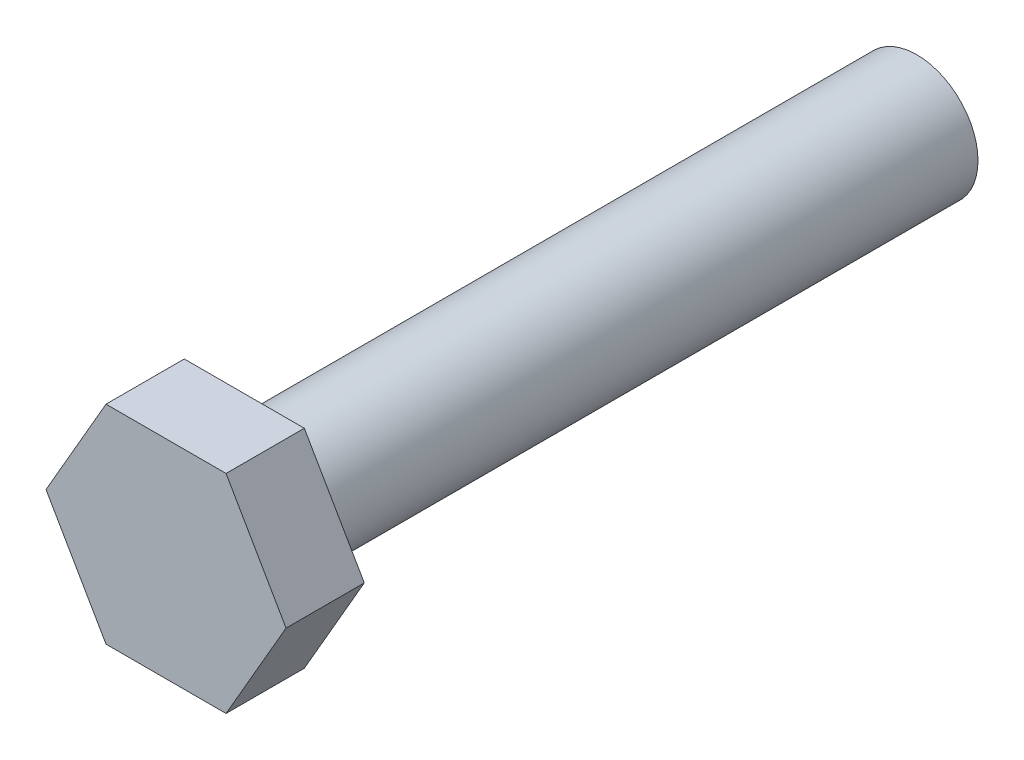
ISO-10303-21;
HEADER;
FILE_DESCRIPTION(('STEP AP214'),'2;1');
FILE_NAME('part.step','',(''),(''),'','','');
FILE_SCHEMA(('AUTOMOTIVE_DESIGN { 1 0 10303 214 1 1 1 1 }'));
ENDSEC;
DATA;
#1=APPLICATION_CONTEXT('core data for automotive mechanical design processes');
#2=APPLICATION_PROTOCOL_DEFINITION('international standard','automotive_design',2000,#1);
#3=PRODUCT_CONTEXT('',#1,'mechanical');
#4=PRODUCT('Part','Part','',(#3));
#5=PRODUCT_RELATED_PRODUCT_CATEGORY('part','',(#4));
#6=PRODUCT_DEFINITION_FORMATION('','',#4);
#7=PRODUCT_DEFINITION_CONTEXT('part definition',#1,'design');
#8=PRODUCT_DEFINITION('design','',#6,#7);
#9=PRODUCT_DEFINITION_SHAPE('','',#8);
#10=(LENGTH_UNIT() NAMED_UNIT(*) SI_UNIT(.MILLI.,.METRE.));
#11=(NAMED_UNIT(*) PLANE_ANGLE_UNIT() SI_UNIT($,.RADIAN.));
#12=(NAMED_UNIT(*) SI_UNIT($,.STERADIAN.) SOLID_ANGLE_UNIT());
#13=UNCERTAINTY_MEASURE_WITH_UNIT(LENGTH_MEASURE(1.E-05),#10,'distance_accuracy_value','');
#14=(GEOMETRIC_REPRESENTATION_CONTEXT(3) GLOBAL_UNCERTAINTY_ASSIGNED_CONTEXT((#13)) GLOBAL_UNIT_ASSIGNED_CONTEXT((#10,
#11,#12)) REPRESENTATION_CONTEXT('',''));
#15=CARTESIAN_POINT('',(0.,0.,0.));
#16=DIRECTION('',(0.,0.,1.));
#17=DIRECTION('',(1.,0.,0.));
#18=AXIS2_PLACEMENT_3D('',#15,#16,#17);
#19=CARTESIAN_POINT('',(0.,0.,-55.));
#20=DIRECTION('',(0.,0.,1.));
#21=DIRECTION('',(1.,0.,0.));
#22=AXIS2_PLACEMENT_3D('',#19,#20,#21);
#23=CYLINDRICAL_SURFACE('',#22,5.);
#24=CARTESIAN_POINT('',(0.,0.,-55.));
#25=DIRECTION('',(0.,0.,1.));
#26=DIRECTION('',(1.,0.,0.));
#27=AXIS2_PLACEMENT_3D('',#24,#25,#26);
#28=CIRCLE('',#27,5.);
#29=CARTESIAN_POINT('',(5.,0.,-55.));
#30=VERTEX_POINT('',#29);
#31=EDGE_CURVE('E11',#30,#30,#28,.T.);
#32=ORIENTED_EDGE('',*,*,#31,.T.);
#33=EDGE_LOOP('',(#32));
#34=FACE_BOUND('',#33,.T.);
#35=CARTESIAN_POINT('',(0.,0.,0.));
#36=DIRECTION('',(0.,0.,1.));
#37=DIRECTION('',(1.,0.,0.));
#38=AXIS2_PLACEMENT_3D('',#35,#36,#37);
#39=CIRCLE('',#38,5.);
#40=CARTESIAN_POINT('',(5.,0.,0.));
#41=VERTEX_POINT('',#40);
#42=EDGE_CURVE('E38',#41,#41,#39,.T.);
#43=ORIENTED_EDGE('',*,*,#42,.F.);
#44=EDGE_LOOP('',(#43));
#45=FACE_BOUND('',#44,.T.);
#46=ADVANCED_FACE('F35',(#34,#45),#23,.T.);
#47=CARTESIAN_POINT('',(0.,0.,-55.));
#48=DIRECTION('',(0.,0.,1.));
#49=DIRECTION('',(1.,0.,0.));
#50=AXIS2_PLACEMENT_3D('',#47,#48,#49);
#51=PLANE('',#50);
#52=ORIENTED_EDGE('',*,*,#31,.F.);
#53=EDGE_LOOP('',(#52));
#54=FACE_BOUND('',#53,.T.);
#55=ADVANCED_FACE('F146',(#54),#51,.F.);
#56=CARTESIAN_POINT('',(4.90747728811182,8.5,6.4));
#57=DIRECTION('',(0.,-1.,0.));
#58=DIRECTION('',(0.,0.,-1.));
#59=AXIS2_PLACEMENT_3D('',#56,#57,#58);
#60=PLANE('',#59);
#61=DIRECTION('',(-1.,0.,0.));
#62=VECTOR('',#61,1.);
#63=CARTESIAN_POINT('',(4.90747728811182,8.5,0.));
#64=LINE('',#63,#62);
#65=CARTESIAN_POINT('',(4.90747728811182,8.5,0.));
#66=VERTEX_POINT('',#65);
#67=CARTESIAN_POINT('',(-4.90747728811182,8.5,0.));
#68=VERTEX_POINT('',#67);
#69=EDGE_CURVE('E120',#66,#68,#64,.T.);
#70=ORIENTED_EDGE('',*,*,#69,.T.);
#71=DIRECTION('',(0.,0.,-1.));
#72=VECTOR('',#71,1.);
#73=CARTESIAN_POINT('',(-4.90747728811182,8.5,6.4));
#74=LINE('',#73,#72);
#75=CARTESIAN_POINT('',(-4.90747728811182,8.5,6.4));
#76=VERTEX_POINT('',#75);
#77=EDGE_CURVE('E137',#76,#68,#74,.T.);
#78=ORIENTED_EDGE('',*,*,#77,.F.);
#79=DIRECTION('',(-1.,0.,0.));
#80=VECTOR('',#79,1.);
#81=CARTESIAN_POINT('',(4.90747728811182,8.5,6.4));
#82=LINE('',#81,#80);
#83=CARTESIAN_POINT('',(4.90747728811182,8.5,6.4));
#84=VERTEX_POINT('',#83);
#85=EDGE_CURVE('E130',#84,#76,#82,.T.);
#86=ORIENTED_EDGE('',*,*,#85,.F.);
#87=DIRECTION('',(0.,0.,-1.));
#88=VECTOR('',#87,1.);
#89=CARTESIAN_POINT('',(4.90747728811182,8.5,6.4));
#90=LINE('',#89,#88);
#91=EDGE_CURVE('E116',#84,#66,#90,.T.);
#92=ORIENTED_EDGE('',*,*,#91,.T.);
#93=EDGE_LOOP('',(#70,#78,#86,#92));
#94=FACE_BOUND('',#93,.T.);
#95=ADVANCED_FACE('F151',(#94),#60,.F.);
#96=CARTESIAN_POINT('',(-4.90747728811182,8.5,6.4));
#97=DIRECTION('',(0.866025403784439,-0.5,0.));
#98=DIRECTION('',(0.5,0.866025403784439,0.));
#99=AXIS2_PLACEMENT_3D('',#96,#97,#98);
#100=PLANE('',#99);
#101=DIRECTION('',(-0.5,-0.866025403784439,0.));
#102=VECTOR('',#101,1.);
#103=CARTESIAN_POINT('',(-4.90747728811182,8.5,0.));
#104=LINE('',#103,#102);
#105=CARTESIAN_POINT('',(-9.81495457622364,0.,0.));
#106=VERTEX_POINT('',#105);
#107=EDGE_CURVE('E123',#68,#106,#104,.T.);
#108=ORIENTED_EDGE('',*,*,#107,.T.);
#109=DIRECTION('',(0.,0.,-1.));
#110=VECTOR('',#109,1.);
#111=CARTESIAN_POINT('',(-9.81495457622364,0.,6.4));
#112=LINE('',#111,#110);
#113=CARTESIAN_POINT('',(-9.81495457622364,0.,6.4));
#114=VERTEX_POINT('',#113);
#115=EDGE_CURVE('E134',#114,#106,#112,.T.);
#116=ORIENTED_EDGE('',*,*,#115,.F.);
#117=DIRECTION('',(-0.5,-0.866025403784439,0.));
#118=VECTOR('',#117,1.);
#119=CARTESIAN_POINT('',(-4.90747728811182,8.5,6.4));
#120=LINE('',#119,#118);
#121=EDGE_CURVE('E89',#76,#114,#120,.T.);
#122=ORIENTED_EDGE('',*,*,#121,.F.);
#123=ORIENTED_EDGE('',*,*,#77,.T.);
#124=EDGE_LOOP('',(#108,#116,#122,#123));
#125=FACE_BOUND('',#124,.T.);
#126=ADVANCED_FACE('F157',(#125),#100,.F.);
#127=CARTESIAN_POINT('',(-9.81495457622364,0.,6.4));
#128=DIRECTION('',(0.866025403784439,0.5,0.));
#129=DIRECTION('',(-0.5,0.866025403784439,0.));
#130=AXIS2_PLACEMENT_3D('',#127,#128,#129);
#131=PLANE('',#130);
#132=DIRECTION('',(0.5,-0.866025403784439,0.));
#133=VECTOR('',#132,1.);
#134=CARTESIAN_POINT('',(-9.81495457622364,0.,0.));
#135=LINE('',#134,#133);
#136=CARTESIAN_POINT('',(-4.90747728811182,-8.5,0.));
#137=VERTEX_POINT('',#136);
#138=EDGE_CURVE('E125',#106,#137,#135,.T.);
#139=ORIENTED_EDGE('',*,*,#138,.T.);
#140=DIRECTION('',(0.,0.,-1.));
#141=VECTOR('',#140,1.);
#142=CARTESIAN_POINT('',(-4.90747728811182,-8.5,6.4));
#143=LINE('',#142,#141);
#144=CARTESIAN_POINT('',(-4.90747728811182,-8.5,6.4));
#145=VERTEX_POINT('',#144);
#146=EDGE_CURVE('E111',#145,#137,#143,.T.);
#147=ORIENTED_EDGE('',*,*,#146,.F.);
#148=DIRECTION('',(0.5,-0.866025403784439,0.));
#149=VECTOR('',#148,1.);
#150=CARTESIAN_POINT('',(-9.81495457622364,0.,6.4));
#151=LINE('',#150,#149);
#152=EDGE_CURVE('E102',#114,#145,#151,.T.);
#153=ORIENTED_EDGE('',*,*,#152,.F.);
#154=ORIENTED_EDGE('',*,*,#115,.T.);
#155=EDGE_LOOP('',(#139,#147,#153,#154));
#156=FACE_BOUND('',#155,.T.);
#157=ADVANCED_FACE('F163',(#156),#131,.F.);
#158=CARTESIAN_POINT('',(-4.90747728811182,-8.5,6.4));
#159=DIRECTION('',(0.,1.,0.));
#160=DIRECTION('',(-1.,0.,0.));
#161=AXIS2_PLACEMENT_3D('',#158,#159,#160);
#162=PLANE('',#161);
#163=DIRECTION('',(1.,0.,0.));
#164=VECTOR('',#163,1.);
#165=CARTESIAN_POINT('',(-4.90747728811182,-8.5,0.));
#166=LINE('',#165,#164);
#167=CARTESIAN_POINT('',(4.90747728811182,-8.5,0.));
#168=VERTEX_POINT('',#167);
#169=EDGE_CURVE('E110',#137,#168,#166,.T.);
#170=ORIENTED_EDGE('',*,*,#169,.T.);
#171=DIRECTION('',(0.,0.,-1.));
#172=VECTOR('',#171,1.);
#173=CARTESIAN_POINT('',(4.90747728811182,-8.5,6.4));
#174=LINE('',#173,#172);
#175=CARTESIAN_POINT('',(4.90747728811182,-8.5,6.4));
#176=VERTEX_POINT('',#175);
#177=EDGE_CURVE('E107',#176,#168,#174,.T.);
#178=ORIENTED_EDGE('',*,*,#177,.F.);
#179=DIRECTION('',(1.,0.,0.));
#180=VECTOR('',#179,1.);
#181=CARTESIAN_POINT('',(-4.90747728811182,-8.5,6.4));
#182=LINE('',#181,#180);
#183=EDGE_CURVE('E96',#145,#176,#182,.T.);
#184=ORIENTED_EDGE('',*,*,#183,.F.);
#185=ORIENTED_EDGE('',*,*,#146,.T.);
#186=EDGE_LOOP('',(#170,#178,#184,#185));
#187=FACE_BOUND('',#186,.T.);
#188=ADVANCED_FACE('F108',(#187),#162,.F.);
#189=CARTESIAN_POINT('',(4.90747728811182,-8.5,6.4));
#190=DIRECTION('',(-0.866025403784439,0.5,0.));
#191=DIRECTION('',(-0.5,-0.866025403784439,0.));
#192=AXIS2_PLACEMENT_3D('',#189,#190,#191);
#193=PLANE('',#192);
#194=DIRECTION('',(0.5,0.866025403784439,0.));
#195=VECTOR('',#194,1.);
#196=CARTESIAN_POINT('',(4.90747728811182,-8.5,0.));
#197=LINE('',#196,#195);
#198=CARTESIAN_POINT('',(9.81495457622364,0.,0.));
#199=VERTEX_POINT('',#198);
#200=EDGE_CURVE('E74',#168,#199,#197,.T.);
#201=ORIENTED_EDGE('',*,*,#200,.T.);
#202=DIRECTION('',(0.,0.,-1.));
#203=VECTOR('',#202,1.);
#204=CARTESIAN_POINT('',(9.81495457622364,0.,6.4));
#205=LINE('',#204,#203);
#206=CARTESIAN_POINT('',(9.81495457622364,0.,6.4));
#207=VERTEX_POINT('',#206);
#208=EDGE_CURVE('E112',#207,#199,#205,.T.);
#209=ORIENTED_EDGE('',*,*,#208,.F.);
#210=DIRECTION('',(0.5,0.866025403784439,0.));
#211=VECTOR('',#210,1.);
#212=CARTESIAN_POINT('',(4.90747728811182,-8.5,6.4));
#213=LINE('',#212,#211);
#214=EDGE_CURVE('E100',#176,#207,#213,.T.);
#215=ORIENTED_EDGE('',*,*,#214,.F.);
#216=ORIENTED_EDGE('',*,*,#177,.T.);
#217=EDGE_LOOP('',(#201,#209,#215,#216));
#218=FACE_BOUND('',#217,.T.);
#219=ADVANCED_FACE('F114',(#218),#193,.F.);
#220=CARTESIAN_POINT('',(9.81495457622364,0.,6.4));
#221=DIRECTION('',(-0.866025403784439,-0.5,0.));
#222=DIRECTION('',(0.5,-0.866025403784439,0.));
#223=AXIS2_PLACEMENT_3D('',#220,#221,#222);
#224=PLANE('',#223);
#225=DIRECTION('',(-0.5,0.866025403784439,0.));
#226=VECTOR('',#225,1.);
#227=CARTESIAN_POINT('',(9.81495457622364,0.,0.));
#228=LINE('',#227,#226);
#229=EDGE_CURVE('E80',#199,#66,#228,.T.);
#230=ORIENTED_EDGE('',*,*,#229,.T.);
#231=ORIENTED_EDGE('',*,*,#91,.F.);
#232=DIRECTION('',(-0.5,0.866025403784439,0.));
#233=VECTOR('',#232,1.);
#234=CARTESIAN_POINT('',(9.81495457622364,0.,6.4));
#235=LINE('',#234,#233);
#236=EDGE_CURVE('E51',#207,#84,#235,.T.);
#237=ORIENTED_EDGE('',*,*,#236,.F.);
#238=ORIENTED_EDGE('',*,*,#208,.T.);
#239=EDGE_LOOP('',(#230,#231,#237,#238));
#240=FACE_BOUND('',#239,.T.);
#241=ADVANCED_FACE('F171',(#240),#224,.F.);
#242=CARTESIAN_POINT('',(-14.7224318643355,8.5,6.4));
#243=DIRECTION('',(0.,0.,1.));
#244=DIRECTION('',(1.,0.,0.));
#245=AXIS2_PLACEMENT_3D('',#242,#243,#244);
#246=PLANE('',#245);
#247=ORIENTED_EDGE('',*,*,#85,.T.);
#248=ORIENTED_EDGE('',*,*,#121,.T.);
#249=ORIENTED_EDGE('',*,*,#152,.T.);
#250=ORIENTED_EDGE('',*,*,#183,.T.);
#251=ORIENTED_EDGE('',*,*,#214,.T.);
#252=ORIENTED_EDGE('',*,*,#236,.T.);
#253=EDGE_LOOP('',(#247,#248,#249,#250,#251,#252));
#254=FACE_BOUND('',#253,.T.);
#255=ADVANCED_FACE('F98',(#254),#246,.T.);
#256=CARTESIAN_POINT('',(-14.7224318643355,8.5,0.));
#257=DIRECTION('',(0.,0.,1.));
#258=DIRECTION('',(1.,0.,0.));
#259=AXIS2_PLACEMENT_3D('',#256,#257,#258);
#260=PLANE('',#259);
#261=ORIENTED_EDGE('',*,*,#42,.T.);
#262=EDGE_LOOP('',(#261));
#263=FACE_BOUND('',#262,.T.);
#264=ORIENTED_EDGE('',*,*,#69,.F.);
#265=ORIENTED_EDGE('',*,*,#229,.F.);
#266=ORIENTED_EDGE('',*,*,#200,.F.);
#267=ORIENTED_EDGE('',*,*,#169,.F.);
#268=ORIENTED_EDGE('',*,*,#138,.F.);
#269=ORIENTED_EDGE('',*,*,#107,.F.);
#270=EDGE_LOOP('',(#264,#265,#266,#267,#268,#269));
#271=FACE_BOUND('',#270,.T.);
#272=ADVANCED_FACE('F142',(#263,#271),#260,.F.);
#273=CLOSED_SHELL('',(#46,#55,#95,#126,#157,#188,#219,#241,#255,#272));
#274=MANIFOLD_SOLID_BREP('B2',#273);
#275=ADVANCED_BREP_SHAPE_REPRESENTATION('',(#18,#274),#14);
#276=SHAPE_DEFINITION_REPRESENTATION(#9,#275);
ENDSEC;
END-ISO-10303-21;
